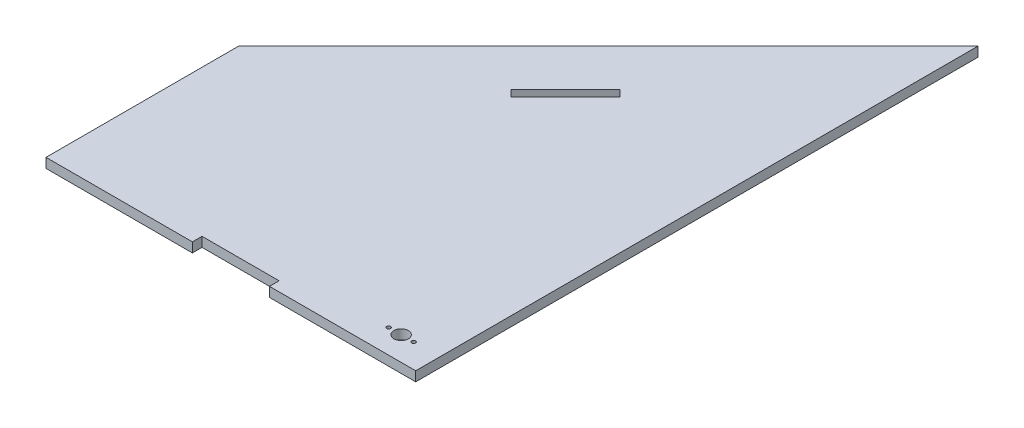
ISO-10303-21;
HEADER;
FILE_DESCRIPTION(('STEP AP214'),'2;1');
FILE_NAME('part.step','',(''),(''),'','','');
FILE_SCHEMA(('AUTOMOTIVE_DESIGN { 1 0 10303 214 1 1 1 1 }'));
ENDSEC;
DATA;
#1=APPLICATION_CONTEXT('core data for automotive mechanical design processes');
#2=APPLICATION_PROTOCOL_DEFINITION('international standard','automotive_design',2000,#1);
#3=PRODUCT_CONTEXT('',#1,'mechanical');
#4=PRODUCT('Part','Part','',(#3));
#5=PRODUCT_RELATED_PRODUCT_CATEGORY('part','',(#4));
#6=PRODUCT_DEFINITION_FORMATION('','',#4);
#7=PRODUCT_DEFINITION_CONTEXT('part definition',#1,'design');
#8=PRODUCT_DEFINITION('design','',#6,#7);
#9=PRODUCT_DEFINITION_SHAPE('','',#8);
#10=(LENGTH_UNIT() NAMED_UNIT(*) SI_UNIT(.MILLI.,.METRE.));
#11=(NAMED_UNIT(*) PLANE_ANGLE_UNIT() SI_UNIT($,.RADIAN.));
#12=(NAMED_UNIT(*) SI_UNIT($,.STERADIAN.) SOLID_ANGLE_UNIT());
#13=UNCERTAINTY_MEASURE_WITH_UNIT(LENGTH_MEASURE(1.E-05),#10,'distance_accuracy_value','');
#14=(GEOMETRIC_REPRESENTATION_CONTEXT(3) GLOBAL_UNCERTAINTY_ASSIGNED_CONTEXT((#13)) GLOBAL_UNIT_ASSIGNED_CONTEXT((#10,
#11,#12)) REPRESENTATION_CONTEXT('',''));
#15=CARTESIAN_POINT('',(0.,0.,0.));
#16=DIRECTION('',(0.,0.,1.));
#17=DIRECTION('',(1.,0.,0.));
#18=AXIS2_PLACEMENT_3D('',#15,#16,#17);
#19=CARTESIAN_POINT('',(63.5,3.175,0.));
#20=DIRECTION('',(0.,0.,-1.));
#21=DIRECTION('',(-1.,0.,0.));
#22=AXIS2_PLACEMENT_3D('',#19,#20,#21);
#23=PLANE('',#22);
#24=DIRECTION('',(1.,0.,0.));
#25=VECTOR('',#24,1.);
#26=CARTESIAN_POINT('',(63.5,0.,0.));
#27=LINE('',#26,#25);
#28=CARTESIAN_POINT('',(0.,0.,0.));
#29=VERTEX_POINT('',#28);
#30=CARTESIAN_POINT('',(48.26,0.,0.));
#31=VERTEX_POINT('',#30);
#32=EDGE_CURVE('E139',#29,#31,#27,.T.);
#33=ORIENTED_EDGE('',*,*,#32,.T.);
#34=DIRECTION('',(0.,1.,0.));
#35=VECTOR('',#34,1.);
#36=CARTESIAN_POINT('',(48.26,0.,0.));
#37=LINE('',#36,#35);
#38=CARTESIAN_POINT('',(48.26,3.175,0.));
#39=VERTEX_POINT('',#38);
#40=EDGE_CURVE('E124',#31,#39,#37,.T.);
#41=ORIENTED_EDGE('',*,*,#40,.T.);
#42=DIRECTION('',(1.,0.,0.));
#43=VECTOR('',#42,1.);
#44=CARTESIAN_POINT('',(0.,3.175,0.));
#45=LINE('',#44,#43);
#46=CARTESIAN_POINT('',(0.,3.175,0.));
#47=VERTEX_POINT('',#46);
#48=EDGE_CURVE('E187',#47,#39,#45,.T.);
#49=ORIENTED_EDGE('',*,*,#48,.F.);
#50=DIRECTION('',(0.,-1.,0.));
#51=VECTOR('',#50,1.);
#52=CARTESIAN_POINT('',(0.,3.175,0.));
#53=LINE('',#52,#51);
#54=EDGE_CURVE('E11',#47,#29,#53,.T.);
#55=ORIENTED_EDGE('',*,*,#54,.T.);
#56=EDGE_LOOP('',(#33,#41,#49,#55));
#57=FACE_BOUND('',#56,.T.);
#58=ADVANCED_FACE('F35',(#57),#23,.F.);
#59=CARTESIAN_POINT('',(0.,3.175,0.));
#60=DIRECTION('',(1.,0.,0.));
#61=DIRECTION('',(0.,0.,-1.));
#62=AXIS2_PLACEMENT_3D('',#59,#60,#61);
#63=PLANE('',#62);
#64=DIRECTION('',(0.,0.,1.));
#65=VECTOR('',#64,1.);
#66=CARTESIAN_POINT('',(0.,0.,0.));
#67=LINE('',#66,#65);
#68=CARTESIAN_POINT('',(0.,0.,-63.5));
#69=VERTEX_POINT('',#68);
#70=EDGE_CURVE('E151',#69,#29,#67,.T.);
#71=ORIENTED_EDGE('',*,*,#70,.T.);
#72=ORIENTED_EDGE('',*,*,#54,.F.);
#73=DIRECTION('',(0.,0.,1.));
#74=VECTOR('',#73,1.);
#75=CARTESIAN_POINT('',(0.,3.175,0.));
#76=LINE('',#75,#74);
#77=CARTESIAN_POINT('',(0.,3.175,-63.5));
#78=VERTEX_POINT('',#77);
#79=EDGE_CURVE('E156',#78,#47,#76,.T.);
#80=ORIENTED_EDGE('',*,*,#79,.F.);
#81=DIRECTION('',(0.,-1.,0.));
#82=VECTOR('',#81,1.);
#83=CARTESIAN_POINT('',(0.,3.175,-63.5));
#84=LINE('',#83,#82);
#85=EDGE_CURVE('E157',#78,#69,#84,.T.);
#86=ORIENTED_EDGE('',*,*,#85,.T.);
#87=EDGE_LOOP('',(#71,#72,#80,#86));
#88=FACE_BOUND('',#87,.T.);
#89=ADVANCED_FACE('F37',(#88),#63,.F.);
#90=CARTESIAN_POINT('',(73.66,3.175,0.));
#91=VERTEX_POINT('',#90);
#92=CARTESIAN_POINT('',(121.87166478695,3.175,0.));
#93=VERTEX_POINT('',#92);
#94=EDGE_CURVE('E175',#91,#93,#45,.T.);
#95=ORIENTED_EDGE('',*,*,#94,.F.);
#96=DIRECTION('',(0.,1.,0.));
#97=VECTOR('',#96,1.);
#98=CARTESIAN_POINT('',(73.66,0.,0.));
#99=LINE('',#98,#97);
#100=CARTESIAN_POINT('',(73.66,0.,0.));
#101=VERTEX_POINT('',#100);
#102=EDGE_CURVE('E133',#101,#91,#99,.T.);
#103=ORIENTED_EDGE('',*,*,#102,.F.);
#104=CARTESIAN_POINT('',(121.87166478695,0.,0.));
#105=VERTEX_POINT('',#104);
#106=EDGE_CURVE('E147',#101,#105,#27,.T.);
#107=ORIENTED_EDGE('',*,*,#106,.T.);
#108=DIRECTION('',(0.,-1.,0.));
#109=VECTOR('',#108,1.);
#110=CARTESIAN_POINT('',(121.87166478695,3.175,0.));
#111=LINE('',#110,#109);
#112=EDGE_CURVE('E43',#93,#105,#111,.T.);
#113=ORIENTED_EDGE('',*,*,#112,.F.);
#114=EDGE_LOOP('',(#95,#103,#107,#113));
#115=FACE_BOUND('',#114,.T.);
#116=ADVANCED_FACE('F173',(#115),#23,.F.);
#117=CARTESIAN_POINT('',(121.87166478695,3.175,-121.549227352983));
#118=DIRECTION('',(-1.,0.,0.));
#119=DIRECTION('',(0.,0.,1.));
#120=AXIS2_PLACEMENT_3D('',#117,#118,#119);
#121=PLANE('',#120);
#122=DIRECTION('',(0.,0.,-1.));
#123=VECTOR('',#122,1.);
#124=CARTESIAN_POINT('',(121.87166478695,0.,-121.549227352983));
#125=LINE('',#124,#123);
#126=CARTESIAN_POINT('',(121.87166478695,0.,-185.371664786949));
#127=VERTEX_POINT('',#126);
#128=EDGE_CURVE('E146',#105,#127,#125,.T.);
#129=ORIENTED_EDGE('',*,*,#128,.T.);
#130=DIRECTION('',(0.,-1.,0.));
#131=VECTOR('',#130,1.);
#132=CARTESIAN_POINT('',(121.87166478695,3.175,-185.371664786949));
#133=LINE('',#132,#131);
#134=CARTESIAN_POINT('',(121.87166478695,3.175,-185.371664786949));
#135=VERTEX_POINT('',#134);
#136=EDGE_CURVE('E160',#135,#127,#133,.T.);
#137=ORIENTED_EDGE('',*,*,#136,.F.);
#138=DIRECTION('',(0.,0.,-1.));
#139=VECTOR('',#138,1.);
#140=CARTESIAN_POINT('',(121.87166478695,3.175,0.));
#141=LINE('',#140,#139);
#142=EDGE_CURVE('E170',#93,#135,#141,.T.);
#143=ORIENTED_EDGE('',*,*,#142,.F.);
#144=ORIENTED_EDGE('',*,*,#112,.T.);
#145=EDGE_LOOP('',(#129,#137,#143,#144));
#146=FACE_BOUND('',#145,.T.);
#147=ADVANCED_FACE('F167',(#146),#121,.F.);
#148=CARTESIAN_POINT('',(0.,3.175,-63.5));
#149=DIRECTION('',(0.707106781186546,0.,0.707106781186549));
#150=DIRECTION('',(0.707106781186549,0.,-0.707106781186546));
#151=AXIS2_PLACEMENT_3D('',#148,#149,#150);
#152=PLANE('',#151);
#153=DIRECTION('',(-0.707106781186549,0.,0.707106781186546));
#154=VECTOR('',#153,1.);
#155=CARTESIAN_POINT('',(0.,0.,-63.5));
#156=LINE('',#155,#154);
#157=EDGE_CURVE('E149',#127,#69,#156,.T.);
#158=ORIENTED_EDGE('',*,*,#157,.T.);
#159=ORIENTED_EDGE('',*,*,#85,.F.);
#160=DIRECTION('',(-0.707106781186549,0.,0.707106781186546));
#161=VECTOR('',#160,1.);
#162=CARTESIAN_POINT('',(0.,3.175,-63.5));
#163=LINE('',#162,#161);
#164=EDGE_CURVE('E161',#135,#78,#163,.T.);
#165=ORIENTED_EDGE('',*,*,#164,.F.);
#166=ORIENTED_EDGE('',*,*,#136,.T.);
#167=EDGE_LOOP('',(#158,#159,#165,#166));
#168=FACE_BOUND('',#167,.T.);
#169=ADVANCED_FACE('F180',(#168),#152,.F.);
#170=CARTESIAN_POINT('',(0.,3.175,0.));
#171=DIRECTION('',(0.,-1.,0.));
#172=DIRECTION('',(0.,0.,-1.));
#173=AXIS2_PLACEMENT_3D('',#170,#171,#172);
#174=PLANE('',#173);
#175=CARTESIAN_POINT('',(113.29916478695,3.175,-7.8994));
#176=DIRECTION('',(0.,1.,0.));
#177=DIRECTION('',(0.,0.,1.));
#178=AXIS2_PLACEMENT_3D('',#175,#176,#177);
#179=CIRCLE('',#178,0.635000000000002);
#180=CARTESIAN_POINT('',(113.29916478695,3.175,-7.2644));
#181=VERTEX_POINT('',#180);
#182=EDGE_CURVE('E207',#181,#181,#179,.T.);
#183=ORIENTED_EDGE('',*,*,#182,.F.);
#184=EDGE_LOOP('',(#183));
#185=FACE_BOUND('',#184,.T.);
#186=CARTESIAN_POINT('',(105.04416478695,3.175,-7.8994));
#187=DIRECTION('',(0.,1.,0.));
#188=DIRECTION('',(0.,0.,1.));
#189=AXIS2_PLACEMENT_3D('',#186,#187,#188);
#190=CIRCLE('',#189,0.635000000000002);
#191=CARTESIAN_POINT('',(105.04416478695,3.175,-7.2644));
#192=VERTEX_POINT('',#191);
#193=EDGE_CURVE('E214',#192,#192,#190,.T.);
#194=ORIENTED_EDGE('',*,*,#193,.F.);
#195=EDGE_LOOP('',(#194));
#196=FACE_BOUND('',#195,.T.);
#197=CARTESIAN_POINT('',(109.17166478695,3.175,-7.8994));
#198=DIRECTION('',(0.,1.,0.));
#199=DIRECTION('',(0.,0.,1.));
#200=AXIS2_PLACEMENT_3D('',#197,#198,#199);
#201=CIRCLE('',#200,2.38125000000001);
#202=CARTESIAN_POINT('',(109.17166478695,3.175,-5.51814999999999));
#203=VERTEX_POINT('',#202);
#204=EDGE_CURVE('E220',#203,#203,#201,.T.);
#205=ORIENTED_EDGE('',*,*,#204,.F.);
#206=EDGE_LOOP('',(#205));
#207=FACE_BOUND('',#206,.T.);
#208=DIRECTION('',(0.707106781186546,0.,0.707106781186549));
#209=VECTOR('',#208,1.);
#210=CARTESIAN_POINT('',(57.2402668407648,3.175,-96.0622943699267));
#211=LINE('',#210,#209);
#212=CARTESIAN_POINT('',(57.2402668407648,3.175,-96.0622943699267));
#213=VERTEX_POINT('',#212);
#214=CARTESIAN_POINT('',(59.4853308710321,3.175,-93.8172303396594));
#215=VERTEX_POINT('',#214);
#216=EDGE_CURVE('E242',#213,#215,#211,.T.);
#217=ORIENTED_EDGE('',*,*,#216,.F.);
#218=DIRECTION('',(-0.707106781186547,0.,0.707106781186548));
#219=VECTOR('',#218,1.);
#220=CARTESIAN_POINT('',(75.2007790829031,3.175,-114.022806612065));
#221=LINE('',#220,#219);
#222=CARTESIAN_POINT('',(75.2007790829031,3.175,-114.022806612065));
#223=VERTEX_POINT('',#222);
#224=EDGE_CURVE('E58',#223,#213,#221,.T.);
#225=ORIENTED_EDGE('',*,*,#224,.F.);
#226=DIRECTION('',(-0.70710678118655,0.,-0.707106781186545));
#227=VECTOR('',#226,1.);
#228=CARTESIAN_POINT('',(77.4458431131704,3.175,-111.777742581798));
#229=LINE('',#228,#227);
#230=CARTESIAN_POINT('',(77.4458431131704,3.175,-111.777742581798));
#231=VERTEX_POINT('',#230);
#232=EDGE_CURVE('E232',#231,#223,#229,.T.);
#233=ORIENTED_EDGE('',*,*,#232,.F.);
#234=DIRECTION('',(0.707106781186547,0.,-0.707106781186548));
#235=VECTOR('',#234,1.);
#236=CARTESIAN_POINT('',(59.4853308710321,3.175,-93.8172303396594));
#237=LINE('',#236,#235);
#238=EDGE_CURVE('E245',#215,#231,#237,.T.);
#239=ORIENTED_EDGE('',*,*,#238,.F.);
#240=EDGE_LOOP('',(#217,#225,#233,#239));
#241=FACE_BOUND('',#240,.T.);
#242=ORIENTED_EDGE('',*,*,#48,.T.);
#243=DIRECTION('',(0.,0.,1.));
#244=VECTOR('',#243,1.);
#245=CARTESIAN_POINT('',(48.26,3.175,0.));
#246=LINE('',#245,#244);
#247=CARTESIAN_POINT('',(48.26,3.175,-3.175));
#248=VERTEX_POINT('',#247);
#249=EDGE_CURVE('E129',#248,#39,#246,.T.);
#250=ORIENTED_EDGE('',*,*,#249,.F.);
#251=DIRECTION('',(-1.,0.,0.));
#252=VECTOR('',#251,1.);
#253=CARTESIAN_POINT('',(48.26,3.175,-3.175));
#254=LINE('',#253,#252);
#255=CARTESIAN_POINT('',(73.66,3.175,-3.17500000000001));
#256=VERTEX_POINT('',#255);
#257=EDGE_CURVE('E142',#256,#248,#254,.T.);
#258=ORIENTED_EDGE('',*,*,#257,.F.);
#259=DIRECTION('',(0.,0.,-1.));
#260=VECTOR('',#259,1.);
#261=CARTESIAN_POINT('',(73.66,3.175,0.));
#262=LINE('',#261,#260);
#263=EDGE_CURVE('E197',#91,#256,#262,.T.);
#264=ORIENTED_EDGE('',*,*,#263,.F.);
#265=ORIENTED_EDGE('',*,*,#94,.T.);
#266=ORIENTED_EDGE('',*,*,#142,.T.);
#267=ORIENTED_EDGE('',*,*,#164,.T.);
#268=ORIENTED_EDGE('',*,*,#79,.T.);
#269=EDGE_LOOP('',(#242,#250,#258,#264,#265,#266,#267,#268));
#270=FACE_BOUND('',#269,.T.);
#271=ADVANCED_FACE('F193',(#185,#196,#207,#241,#270),#174,.F.);
#272=CARTESIAN_POINT('',(0.,0.,0.));
#273=DIRECTION('',(0.,-1.,0.));
#274=DIRECTION('',(0.,0.,-1.));
#275=AXIS2_PLACEMENT_3D('',#272,#273,#274);
#276=PLANE('',#275);
#277=DIRECTION('',(0.,0.,1.));
#278=VECTOR('',#277,1.);
#279=CARTESIAN_POINT('',(48.26,0.,0.));
#280=LINE('',#279,#278);
#281=CARTESIAN_POINT('',(48.26,0.,-3.175));
#282=VERTEX_POINT('',#281);
#283=EDGE_CURVE('E127',#282,#31,#280,.T.);
#284=ORIENTED_EDGE('',*,*,#283,.T.);
#285=ORIENTED_EDGE('',*,*,#32,.F.);
#286=ORIENTED_EDGE('',*,*,#70,.F.);
#287=ORIENTED_EDGE('',*,*,#157,.F.);
#288=ORIENTED_EDGE('',*,*,#128,.F.);
#289=ORIENTED_EDGE('',*,*,#106,.F.);
#290=DIRECTION('',(0.,0.,-1.));
#291=VECTOR('',#290,1.);
#292=CARTESIAN_POINT('',(73.66,0.,0.));
#293=LINE('',#292,#291);
#294=CARTESIAN_POINT('',(73.66,0.,-3.17500000000001));
#295=VERTEX_POINT('',#294);
#296=EDGE_CURVE('E141',#101,#295,#293,.T.);
#297=ORIENTED_EDGE('',*,*,#296,.T.);
#298=DIRECTION('',(-1.,0.,0.));
#299=VECTOR('',#298,1.);
#300=CARTESIAN_POINT('',(48.26,0.,-3.175));
#301=LINE('',#300,#299);
#302=EDGE_CURVE('E50',#295,#282,#301,.T.);
#303=ORIENTED_EDGE('',*,*,#302,.T.);
#304=EDGE_LOOP('',(#284,#285,#286,#287,#288,#289,#297,#303));
#305=FACE_BOUND('',#304,.T.);
#306=CARTESIAN_POINT('',(113.29916478695,0.,-7.8994));
#307=DIRECTION('',(0.,1.,0.));
#308=DIRECTION('',(0.,0.,1.));
#309=AXIS2_PLACEMENT_3D('',#306,#307,#308);
#310=CIRCLE('',#309,0.635000000000002);
#311=CARTESIAN_POINT('',(113.29916478695,0.,-7.2644));
#312=VERTEX_POINT('',#311);
#313=EDGE_CURVE('E211',#312,#312,#310,.T.);
#314=ORIENTED_EDGE('',*,*,#313,.T.);
#315=EDGE_LOOP('',(#314));
#316=FACE_BOUND('',#315,.T.);
#317=CARTESIAN_POINT('',(105.04416478695,0.,-7.8994));
#318=DIRECTION('',(0.,1.,0.));
#319=DIRECTION('',(0.,0.,1.));
#320=AXIS2_PLACEMENT_3D('',#317,#318,#319);
#321=CIRCLE('',#320,0.635000000000002);
#322=CARTESIAN_POINT('',(105.04416478695,0.,-7.2644));
#323=VERTEX_POINT('',#322);
#324=EDGE_CURVE('E217',#323,#323,#321,.T.);
#325=ORIENTED_EDGE('',*,*,#324,.T.);
#326=EDGE_LOOP('',(#325));
#327=FACE_BOUND('',#326,.T.);
#328=CARTESIAN_POINT('',(109.17166478695,0.,-7.8994));
#329=DIRECTION('',(0.,1.,0.));
#330=DIRECTION('',(0.,0.,1.));
#331=AXIS2_PLACEMENT_3D('',#328,#329,#330);
#332=CIRCLE('',#331,2.38125000000001);
#333=CARTESIAN_POINT('',(109.17166478695,0.,-5.51814999999999));
#334=VERTEX_POINT('',#333);
#335=EDGE_CURVE('E223',#334,#334,#332,.T.);
#336=ORIENTED_EDGE('',*,*,#335,.T.);
#337=EDGE_LOOP('',(#336));
#338=FACE_BOUND('',#337,.T.);
#339=DIRECTION('',(-0.707106781186547,0.,0.707106781186548));
#340=VECTOR('',#339,1.);
#341=CARTESIAN_POINT('',(75.2007790829031,0.,-114.022806612065));
#342=LINE('',#341,#340);
#343=CARTESIAN_POINT('',(75.2007790829031,0.,-114.022806612065));
#344=VERTEX_POINT('',#343);
#345=CARTESIAN_POINT('',(57.2402668407648,0.,-96.0622943699267));
#346=VERTEX_POINT('',#345);
#347=EDGE_CURVE('E228',#344,#346,#342,.T.);
#348=ORIENTED_EDGE('',*,*,#347,.T.);
#349=DIRECTION('',(0.707106781186546,0.,0.707106781186549));
#350=VECTOR('',#349,1.);
#351=CARTESIAN_POINT('',(57.2402668407648,0.,-96.0622943699267));
#352=LINE('',#351,#350);
#353=CARTESIAN_POINT('',(59.4853308710321,0.,-93.8172303396594));
#354=VERTEX_POINT('',#353);
#355=EDGE_CURVE('E231',#346,#354,#352,.T.);
#356=ORIENTED_EDGE('',*,*,#355,.T.);
#357=DIRECTION('',(0.707106781186547,0.,-0.707106781186548));
#358=VECTOR('',#357,1.);
#359=CARTESIAN_POINT('',(59.4853308710321,0.,-93.8172303396594));
#360=LINE('',#359,#358);
#361=CARTESIAN_POINT('',(77.4458431131704,0.,-111.777742581798));
#362=VERTEX_POINT('',#361);
#363=EDGE_CURVE('E235',#354,#362,#360,.T.);
#364=ORIENTED_EDGE('',*,*,#363,.T.);
#365=DIRECTION('',(-0.70710678118655,0.,-0.707106781186545));
#366=VECTOR('',#365,1.);
#367=CARTESIAN_POINT('',(77.4458431131704,0.,-111.777742581798));
#368=LINE('',#367,#366);
#369=EDGE_CURVE('E238',#362,#344,#368,.T.);
#370=ORIENTED_EDGE('',*,*,#369,.T.);
#371=EDGE_LOOP('',(#348,#356,#364,#370));
#372=FACE_BOUND('',#371,.T.);
#373=ADVANCED_FACE('F136',(#305,#316,#327,#338,#372),#276,.T.);
#374=CARTESIAN_POINT('',(75.2007790829031,0.,-114.022806612065));
#375=DIRECTION('',(-0.707106781186548,0.,-0.707106781186547));
#376=DIRECTION('',(-0.707106781186547,0.,0.707106781186548));
#377=AXIS2_PLACEMENT_3D('',#374,#375,#376);
#378=PLANE('',#377);
#379=ORIENTED_EDGE('',*,*,#224,.T.);
#380=DIRECTION('',(0.,1.,0.));
#381=VECTOR('',#380,1.);
#382=CARTESIAN_POINT('',(57.2402668407648,0.,-96.0622943699267));
#383=LINE('',#382,#381);
#384=EDGE_CURVE('E190',#346,#213,#383,.T.);
#385=ORIENTED_EDGE('',*,*,#384,.F.);
#386=ORIENTED_EDGE('',*,*,#347,.F.);
#387=DIRECTION('',(0.,1.,0.));
#388=VECTOR('',#387,1.);
#389=CARTESIAN_POINT('',(75.2007790829031,0.,-114.022806612065));
#390=LINE('',#389,#388);
#391=EDGE_CURVE('E250',#344,#223,#390,.T.);
#392=ORIENTED_EDGE('',*,*,#391,.T.);
#393=EDGE_LOOP('',(#379,#385,#386,#392));
#394=FACE_BOUND('',#393,.T.);
#395=ADVANCED_FACE('F269',(#394),#378,.F.);
#396=CARTESIAN_POINT('',(77.4458431131704,0.,-111.777742581798));
#397=DIRECTION('',(0.707106781186545,0.,-0.70710678118655));
#398=DIRECTION('',(-0.70710678118655,0.,-0.707106781186545));
#399=AXIS2_PLACEMENT_3D('',#396,#397,#398);
#400=PLANE('',#399);
#401=ORIENTED_EDGE('',*,*,#232,.T.);
#402=ORIENTED_EDGE('',*,*,#391,.F.);
#403=ORIENTED_EDGE('',*,*,#369,.F.);
#404=DIRECTION('',(0.,1.,0.));
#405=VECTOR('',#404,1.);
#406=CARTESIAN_POINT('',(77.4458431131704,0.,-111.777742581798));
#407=LINE('',#406,#405);
#408=EDGE_CURVE('E252',#362,#231,#407,.T.);
#409=ORIENTED_EDGE('',*,*,#408,.T.);
#410=EDGE_LOOP('',(#401,#402,#403,#409));
#411=FACE_BOUND('',#410,.T.);
#412=ADVANCED_FACE('F267',(#411),#400,.F.);
#413=CARTESIAN_POINT('',(59.4853308710321,0.,-93.8172303396594));
#414=DIRECTION('',(0.707106781186548,0.,0.707106781186547));
#415=DIRECTION('',(0.707106781186547,0.,-0.707106781186548));
#416=AXIS2_PLACEMENT_3D('',#413,#414,#415);
#417=PLANE('',#416);
#418=ORIENTED_EDGE('',*,*,#238,.T.);
#419=ORIENTED_EDGE('',*,*,#408,.F.);
#420=ORIENTED_EDGE('',*,*,#363,.F.);
#421=DIRECTION('',(0.,1.,0.));
#422=VECTOR('',#421,1.);
#423=CARTESIAN_POINT('',(59.4853308710321,0.,-93.8172303396594));
#424=LINE('',#423,#422);
#425=EDGE_CURVE('E253',#354,#215,#424,.T.);
#426=ORIENTED_EDGE('',*,*,#425,.T.);
#427=EDGE_LOOP('',(#418,#419,#420,#426));
#428=FACE_BOUND('',#427,.T.);
#429=ADVANCED_FACE('F264',(#428),#417,.F.);
#430=CARTESIAN_POINT('',(57.2402668407648,0.,-96.0622943699267));
#431=DIRECTION('',(-0.707106781186549,0.,0.707106781186546));
#432=DIRECTION('',(0.707106781186546,0.,0.707106781186549));
#433=AXIS2_PLACEMENT_3D('',#430,#431,#432);
#434=PLANE('',#433);
#435=ORIENTED_EDGE('',*,*,#216,.T.);
#436=ORIENTED_EDGE('',*,*,#425,.F.);
#437=ORIENTED_EDGE('',*,*,#355,.F.);
#438=ORIENTED_EDGE('',*,*,#384,.T.);
#439=EDGE_LOOP('',(#435,#436,#437,#438));
#440=FACE_BOUND('',#439,.T.);
#441=ADVANCED_FACE('F259',(#440),#434,.F.);
#442=CARTESIAN_POINT('',(109.17166478695,0.,-7.8994));
#443=DIRECTION('',(0.,1.,0.));
#444=DIRECTION('',(0.,0.,1.));
#445=AXIS2_PLACEMENT_3D('',#442,#443,#444);
#446=CYLINDRICAL_SURFACE('',#445,2.38125000000001);
#447=ORIENTED_EDGE('',*,*,#335,.F.);
#448=EDGE_LOOP('',(#447));
#449=FACE_BOUND('',#448,.T.);
#450=ORIENTED_EDGE('',*,*,#204,.T.);
#451=EDGE_LOOP('',(#450));
#452=FACE_BOUND('',#451,.T.);
#453=ADVANCED_FACE('F303',(#449,#452),#446,.F.);
#454=CARTESIAN_POINT('',(105.04416478695,0.,-7.8994));
#455=DIRECTION('',(0.,1.,0.));
#456=DIRECTION('',(0.,0.,1.));
#457=AXIS2_PLACEMENT_3D('',#454,#455,#456);
#458=CYLINDRICAL_SURFACE('',#457,0.635000000000002);
#459=ORIENTED_EDGE('',*,*,#324,.F.);
#460=EDGE_LOOP('',(#459));
#461=FACE_BOUND('',#460,.T.);
#462=ORIENTED_EDGE('',*,*,#193,.T.);
#463=EDGE_LOOP('',(#462));
#464=FACE_BOUND('',#463,.T.);
#465=ADVANCED_FACE('F305',(#461,#464),#458,.F.);
#466=CARTESIAN_POINT('',(113.29916478695,0.,-7.8994));
#467=DIRECTION('',(0.,1.,0.));
#468=DIRECTION('',(0.,0.,1.));
#469=AXIS2_PLACEMENT_3D('',#466,#467,#468);
#470=CYLINDRICAL_SURFACE('',#469,0.635000000000002);
#471=ORIENTED_EDGE('',*,*,#313,.F.);
#472=EDGE_LOOP('',(#471));
#473=FACE_BOUND('',#472,.T.);
#474=ORIENTED_EDGE('',*,*,#182,.T.);
#475=EDGE_LOOP('',(#474));
#476=FACE_BOUND('',#475,.T.);
#477=ADVANCED_FACE('F312',(#473,#476),#470,.F.);
#478=CARTESIAN_POINT('',(48.26,0.,0.));
#479=DIRECTION('',(-1.,0.,0.));
#480=DIRECTION('',(0.,0.,1.));
#481=AXIS2_PLACEMENT_3D('',#478,#479,#480);
#482=PLANE('',#481);
#483=ORIENTED_EDGE('',*,*,#249,.T.);
#484=ORIENTED_EDGE('',*,*,#40,.F.);
#485=ORIENTED_EDGE('',*,*,#283,.F.);
#486=DIRECTION('',(0.,1.,0.));
#487=VECTOR('',#486,1.);
#488=CARTESIAN_POINT('',(48.26,0.,-3.175));
#489=LINE('',#488,#487);
#490=EDGE_CURVE('E205',#282,#248,#489,.T.);
#491=ORIENTED_EDGE('',*,*,#490,.T.);
#492=EDGE_LOOP('',(#483,#484,#485,#491));
#493=FACE_BOUND('',#492,.T.);
#494=ADVANCED_FACE('F126',(#493),#482,.F.);
#495=CARTESIAN_POINT('',(48.26,0.,-3.175));
#496=DIRECTION('',(0.,0.,-1.));
#497=DIRECTION('',(-1.,0.,0.));
#498=AXIS2_PLACEMENT_3D('',#495,#496,#497);
#499=PLANE('',#498);
#500=ORIENTED_EDGE('',*,*,#257,.T.);
#501=ORIENTED_EDGE('',*,*,#490,.F.);
#502=ORIENTED_EDGE('',*,*,#302,.F.);
#503=DIRECTION('',(0.,1.,0.));
#504=VECTOR('',#503,1.);
#505=CARTESIAN_POINT('',(73.66,0.,-3.17500000000001));
#506=LINE('',#505,#504);
#507=EDGE_CURVE('E208',#295,#256,#506,.T.);
#508=ORIENTED_EDGE('',*,*,#507,.T.);
#509=EDGE_LOOP('',(#500,#501,#502,#508));
#510=FACE_BOUND('',#509,.T.);
#511=ADVANCED_FACE('F354',(#510),#499,.F.);
#512=CARTESIAN_POINT('',(73.66,0.,0.));
#513=DIRECTION('',(1.,0.,0.));
#514=DIRECTION('',(0.,0.,-1.));
#515=AXIS2_PLACEMENT_3D('',#512,#513,#514);
#516=PLANE('',#515);
#517=ORIENTED_EDGE('',*,*,#263,.T.);
#518=ORIENTED_EDGE('',*,*,#507,.F.);
#519=ORIENTED_EDGE('',*,*,#296,.F.);
#520=ORIENTED_EDGE('',*,*,#102,.T.);
#521=EDGE_LOOP('',(#517,#518,#519,#520));
#522=FACE_BOUND('',#521,.T.);
#523=ADVANCED_FACE('F363',(#522),#516,.F.);
#524=CLOSED_SHELL('',(#58,#89,#116,#147,#169,#271,#373,#395,#412,#429,#441,#453,#465,#477,#494,
#511,#523));
#525=MANIFOLD_SOLID_BREP('B2',#524);
#526=ADVANCED_BREP_SHAPE_REPRESENTATION('',(#18,#525),#14);
#527=SHAPE_DEFINITION_REPRESENTATION(#9,#526);
ENDSEC;
END-ISO-10303-21;
